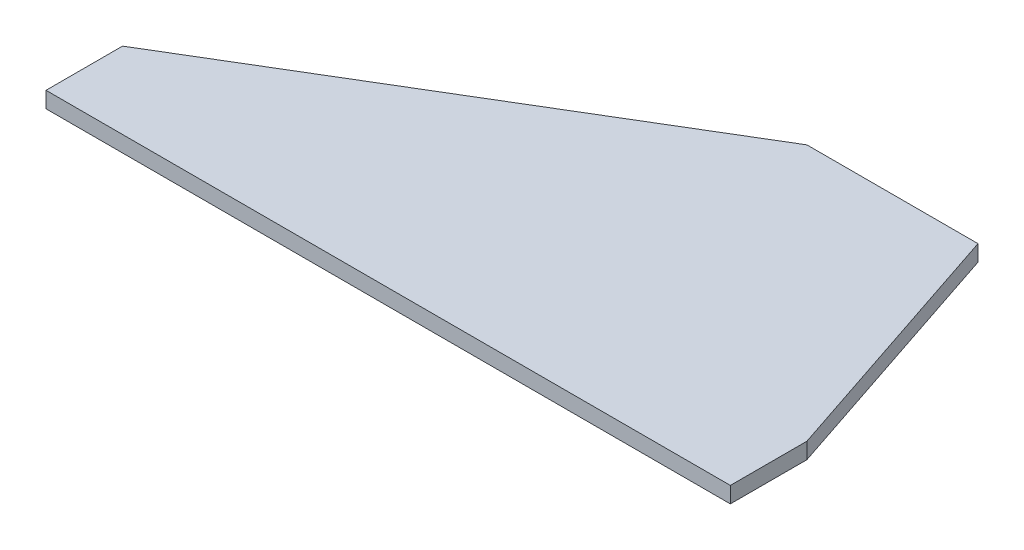
ISO-10303-21;
HEADER;
FILE_DESCRIPTION(('STEP AP214'),'2;1');
FILE_NAME('part.step','',(''),(''),'','','');
FILE_SCHEMA(('AUTOMOTIVE_DESIGN { 1 0 10303 214 1 1 1 1 }'));
ENDSEC;
DATA;
#1=APPLICATION_CONTEXT('core data for automotive mechanical design processes');
#2=APPLICATION_PROTOCOL_DEFINITION('international standard','automotive_design',2000,#1);
#3=PRODUCT_CONTEXT('',#1,'mechanical');
#4=PRODUCT('Part','Part','',(#3));
#5=PRODUCT_RELATED_PRODUCT_CATEGORY('part','',(#4));
#6=PRODUCT_DEFINITION_FORMATION('','',#4);
#7=PRODUCT_DEFINITION_CONTEXT('part definition',#1,'design');
#8=PRODUCT_DEFINITION('design','',#6,#7);
#9=PRODUCT_DEFINITION_SHAPE('','',#8);
#10=(LENGTH_UNIT() NAMED_UNIT(*) SI_UNIT(.MILLI.,.METRE.));
#11=(NAMED_UNIT(*) PLANE_ANGLE_UNIT() SI_UNIT($,.RADIAN.));
#12=(NAMED_UNIT(*) SI_UNIT($,.STERADIAN.) SOLID_ANGLE_UNIT());
#13=UNCERTAINTY_MEASURE_WITH_UNIT(LENGTH_MEASURE(1.E-05),#10,'distance_accuracy_value','');
#14=(GEOMETRIC_REPRESENTATION_CONTEXT(3) GLOBAL_UNCERTAINTY_ASSIGNED_CONTEXT((#13)) GLOBAL_UNIT_ASSIGNED_CONTEXT((#10,
#11,#12)) REPRESENTATION_CONTEXT('',''));
#15=CARTESIAN_POINT('',(0.,0.,0.));
#16=DIRECTION('',(0.,0.,1.));
#17=DIRECTION('',(1.,0.,0.));
#18=AXIS2_PLACEMENT_3D('',#15,#16,#17);
#19=CARTESIAN_POINT('',(127.,-2.38125,-98.933));
#20=DIRECTION('',(0.,0.,1.));
#21=DIRECTION('',(1.,0.,0.));
#22=AXIS2_PLACEMENT_3D('',#19,#20,#21);
#23=PLANE('',#22);
#24=DIRECTION('',(0.,1.,0.));
#25=VECTOR('',#24,1.);
#26=CARTESIAN_POINT('',(127.,-2.38125,-98.933));
#27=LINE('',#26,#25);
#28=CARTESIAN_POINT('',(127.,-2.38125,-98.933));
#29=VERTEX_POINT('',#28);
#30=CARTESIAN_POINT('',(127.,2.38125,-98.933));
#31=VERTEX_POINT('',#30);
#32=EDGE_CURVE('E103',#29,#31,#27,.T.);
#33=ORIENTED_EDGE('',*,*,#32,.T.);
#34=DIRECTION('',(1.,0.,0.));
#35=VECTOR('',#34,1.);
#36=CARTESIAN_POINT('',(127.,2.38125,-98.933));
#37=LINE('',#36,#35);
#38=CARTESIAN_POINT('',(177.8,2.38125,-98.933));
#39=VERTEX_POINT('',#38);
#40=EDGE_CURVE('E97',#31,#39,#37,.T.);
#41=ORIENTED_EDGE('',*,*,#40,.T.);
#42=DIRECTION('',(0.,1.,0.));
#43=VECTOR('',#42,1.);
#44=CARTESIAN_POINT('',(177.8,-2.38125,-98.933));
#45=LINE('',#44,#43);
#46=CARTESIAN_POINT('',(177.8,-2.38125,-98.933));
#47=VERTEX_POINT('',#46);
#48=EDGE_CURVE('E11',#47,#39,#45,.T.);
#49=ORIENTED_EDGE('',*,*,#48,.F.);
#50=DIRECTION('',(1.,0.,0.));
#51=VECTOR('',#50,1.);
#52=CARTESIAN_POINT('',(127.,-2.38125,-98.933));
#53=LINE('',#52,#51);
#54=EDGE_CURVE('E115',#29,#47,#53,.T.);
#55=ORIENTED_EDGE('',*,*,#54,.F.);
#56=EDGE_LOOP('',(#33,#41,#49,#55));
#57=FACE_BOUND('',#56,.T.);
#58=ADVANCED_FACE('F33',(#57),#23,.F.);
#59=CARTESIAN_POINT('',(177.8,-2.38125,-98.933));
#60=DIRECTION('',(-0.948683298050514,0.,0.316227766016838));
#61=DIRECTION('',(0.316227766016838,0.,0.948683298050514));
#62=AXIS2_PLACEMENT_3D('',#59,#60,#61);
#63=PLANE('',#62);
#64=ORIENTED_EDGE('',*,*,#48,.T.);
#65=DIRECTION('',(0.316227766016838,0.,0.948683298050514));
#66=VECTOR('',#65,1.);
#67=CARTESIAN_POINT('',(177.8,2.38125,-98.933));
#68=LINE('',#67,#66);
#69=CARTESIAN_POINT('',(203.2,2.38125,-22.733));
#70=VERTEX_POINT('',#69);
#71=EDGE_CURVE('E87',#39,#70,#68,.T.);
#72=ORIENTED_EDGE('',*,*,#71,.T.);
#73=DIRECTION('',(0.,1.,0.));
#74=VECTOR('',#73,1.);
#75=CARTESIAN_POINT('',(203.2,-2.38125,-22.733));
#76=LINE('',#75,#74);
#77=CARTESIAN_POINT('',(203.2,-2.38125,-22.733));
#78=VERTEX_POINT('',#77);
#79=EDGE_CURVE('E40',#78,#70,#76,.T.);
#80=ORIENTED_EDGE('',*,*,#79,.F.);
#81=DIRECTION('',(0.316227766016838,0.,0.948683298050514));
#82=VECTOR('',#81,1.);
#83=CARTESIAN_POINT('',(177.8,-2.38125,-98.933));
#84=LINE('',#83,#82);
#85=EDGE_CURVE('E88',#47,#78,#84,.T.);
#86=ORIENTED_EDGE('',*,*,#85,.F.);
#87=EDGE_LOOP('',(#64,#72,#80,#86));
#88=FACE_BOUND('',#87,.T.);
#89=ADVANCED_FACE('F85',(#88),#63,.F.);
#90=CARTESIAN_POINT('',(203.2,-2.38125,-22.733));
#91=DIRECTION('',(-1.,0.,0.));
#92=DIRECTION('',(0.,0.,1.));
#93=AXIS2_PLACEMENT_3D('',#90,#91,#92);
#94=PLANE('',#93);
#95=ORIENTED_EDGE('',*,*,#79,.T.);
#96=DIRECTION('',(0.,0.,1.));
#97=VECTOR('',#96,1.);
#98=CARTESIAN_POINT('',(203.2,2.38125,-22.733));
#99=LINE('',#98,#97);
#100=CARTESIAN_POINT('',(203.2,2.38125,0.));
#101=VERTEX_POINT('',#100);
#102=EDGE_CURVE('E101',#70,#101,#99,.T.);
#103=ORIENTED_EDGE('',*,*,#102,.T.);
#104=DIRECTION('',(0.,1.,0.));
#105=VECTOR('',#104,1.);
#106=CARTESIAN_POINT('',(203.2,-2.38125,0.));
#107=LINE('',#106,#105);
#108=CARTESIAN_POINT('',(203.2,-2.38125,0.));
#109=VERTEX_POINT('',#108);
#110=EDGE_CURVE('E129',#109,#101,#107,.T.);
#111=ORIENTED_EDGE('',*,*,#110,.F.);
#112=DIRECTION('',(0.,0.,1.));
#113=VECTOR('',#112,1.);
#114=CARTESIAN_POINT('',(203.2,-2.38125,-22.733));
#115=LINE('',#114,#113);
#116=EDGE_CURVE('E118',#78,#109,#115,.T.);
#117=ORIENTED_EDGE('',*,*,#116,.F.);
#118=EDGE_LOOP('',(#95,#103,#111,#117));
#119=FACE_BOUND('',#118,.T.);
#120=ADVANCED_FACE('F132',(#119),#94,.F.);
#121=CARTESIAN_POINT('',(203.2,-2.38125,0.));
#122=DIRECTION('',(0.,0.,-1.));
#123=DIRECTION('',(-1.,0.,0.));
#124=AXIS2_PLACEMENT_3D('',#121,#122,#123);
#125=PLANE('',#124);
#126=ORIENTED_EDGE('',*,*,#110,.T.);
#127=DIRECTION('',(-1.,0.,0.));
#128=VECTOR('',#127,1.);
#129=CARTESIAN_POINT('',(203.2,2.38125,0.));
#130=LINE('',#129,#128);
#131=CARTESIAN_POINT('',(0.,2.38125,0.));
#132=VERTEX_POINT('',#131);
#133=EDGE_CURVE('E107',#101,#132,#130,.T.);
#134=ORIENTED_EDGE('',*,*,#133,.T.);
#135=DIRECTION('',(0.,1.,0.));
#136=VECTOR('',#135,1.);
#137=CARTESIAN_POINT('',(0.,-2.38125,0.));
#138=LINE('',#137,#136);
#139=CARTESIAN_POINT('',(0.,-2.38125,0.));
#140=VERTEX_POINT('',#139);
#141=EDGE_CURVE('E127',#140,#132,#138,.T.);
#142=ORIENTED_EDGE('',*,*,#141,.F.);
#143=DIRECTION('',(-1.,0.,0.));
#144=VECTOR('',#143,1.);
#145=CARTESIAN_POINT('',(203.2,-2.38125,0.));
#146=LINE('',#145,#144);
#147=EDGE_CURVE('E120',#109,#140,#146,.T.);
#148=ORIENTED_EDGE('',*,*,#147,.F.);
#149=EDGE_LOOP('',(#126,#134,#142,#148));
#150=FACE_BOUND('',#149,.T.);
#151=ADVANCED_FACE('F138',(#150),#125,.F.);
#152=CARTESIAN_POINT('',(0.,-2.38125,0.));
#153=DIRECTION('',(1.,0.,0.));
#154=DIRECTION('',(0.,0.,-1.));
#155=AXIS2_PLACEMENT_3D('',#152,#153,#154);
#156=PLANE('',#155);
#157=ORIENTED_EDGE('',*,*,#141,.T.);
#158=DIRECTION('',(0.,0.,-1.));
#159=VECTOR('',#158,1.);
#160=CARTESIAN_POINT('',(0.,2.38125,0.));
#161=LINE('',#160,#159);
#162=CARTESIAN_POINT('',(0.,2.38125,-22.733));
#163=VERTEX_POINT('',#162);
#164=EDGE_CURVE('E110',#132,#163,#161,.T.);
#165=ORIENTED_EDGE('',*,*,#164,.T.);
#166=DIRECTION('',(0.,1.,0.));
#167=VECTOR('',#166,1.);
#168=CARTESIAN_POINT('',(0.,-2.38125,-22.733));
#169=LINE('',#168,#167);
#170=CARTESIAN_POINT('',(0.,-2.38125,-22.733));
#171=VERTEX_POINT('',#170);
#172=EDGE_CURVE('E125',#171,#163,#169,.T.);
#173=ORIENTED_EDGE('',*,*,#172,.F.);
#174=DIRECTION('',(0.,0.,-1.));
#175=VECTOR('',#174,1.);
#176=CARTESIAN_POINT('',(0.,-2.38125,0.));
#177=LINE('',#176,#175);
#178=EDGE_CURVE('E52',#140,#171,#177,.T.);
#179=ORIENTED_EDGE('',*,*,#178,.F.);
#180=EDGE_LOOP('',(#157,#165,#173,#179));
#181=FACE_BOUND('',#180,.T.);
#182=ADVANCED_FACE('F141',(#181),#156,.F.);
#183=CARTESIAN_POINT('',(0.,-2.38125,-22.733));
#184=DIRECTION('',(0.514495755427527,0.,0.857492925712544));
#185=DIRECTION('',(0.857492925712544,0.,-0.514495755427527));
#186=AXIS2_PLACEMENT_3D('',#183,#184,#185);
#187=PLANE('',#186);
#188=ORIENTED_EDGE('',*,*,#172,.T.);
#189=DIRECTION('',(0.857492925712544,0.,-0.514495755427527));
#190=VECTOR('',#189,1.);
#191=CARTESIAN_POINT('',(0.,2.38125,-22.733));
#192=LINE('',#191,#190);
#193=EDGE_CURVE('E113',#163,#31,#192,.T.);
#194=ORIENTED_EDGE('',*,*,#193,.T.);
#195=ORIENTED_EDGE('',*,*,#32,.F.);
#196=DIRECTION('',(0.857492925712544,0.,-0.514495755427527));
#197=VECTOR('',#196,1.);
#198=CARTESIAN_POINT('',(0.,-2.38125,-22.733));
#199=LINE('',#198,#197);
#200=EDGE_CURVE('E47',#171,#29,#199,.T.);
#201=ORIENTED_EDGE('',*,*,#200,.F.);
#202=EDGE_LOOP('',(#188,#194,#195,#201));
#203=FACE_BOUND('',#202,.T.);
#204=ADVANCED_FACE('F143',(#203),#187,.F.);
#205=CARTESIAN_POINT('',(0.,-2.38125,0.));
#206=DIRECTION('',(0.,-1.,0.));
#207=DIRECTION('',(0.,0.,-1.));
#208=AXIS2_PLACEMENT_3D('',#205,#206,#207);
#209=PLANE('',#208);
#210=ORIENTED_EDGE('',*,*,#54,.T.);
#211=ORIENTED_EDGE('',*,*,#85,.T.);
#212=ORIENTED_EDGE('',*,*,#116,.T.);
#213=ORIENTED_EDGE('',*,*,#147,.T.);
#214=ORIENTED_EDGE('',*,*,#178,.T.);
#215=ORIENTED_EDGE('',*,*,#200,.T.);
#216=EDGE_LOOP('',(#210,#211,#212,#213,#214,#215));
#217=FACE_BOUND('',#216,.T.);
#218=ADVANCED_FACE('F135',(#217),#209,.T.);
#219=CARTESIAN_POINT('',(0.,2.38125,0.));
#220=DIRECTION('',(0.,-1.,0.));
#221=DIRECTION('',(0.,0.,-1.));
#222=AXIS2_PLACEMENT_3D('',#219,#220,#221);
#223=PLANE('',#222);
#224=ORIENTED_EDGE('',*,*,#40,.F.);
#225=ORIENTED_EDGE('',*,*,#193,.F.);
#226=ORIENTED_EDGE('',*,*,#164,.F.);
#227=ORIENTED_EDGE('',*,*,#133,.F.);
#228=ORIENTED_EDGE('',*,*,#102,.F.);
#229=ORIENTED_EDGE('',*,*,#71,.F.);
#230=EDGE_LOOP('',(#224,#225,#226,#227,#228,#229));
#231=FACE_BOUND('',#230,.T.);
#232=ADVANCED_FACE('F95',(#231),#223,.F.);
#233=CLOSED_SHELL('',(#58,#89,#120,#151,#182,#204,#218,#232));
#234=MANIFOLD_SOLID_BREP('B2',#233);
#235=ADVANCED_BREP_SHAPE_REPRESENTATION('',(#18,#234),#14);
#236=SHAPE_DEFINITION_REPRESENTATION(#9,#235);
ENDSEC;
END-ISO-10303-21;
